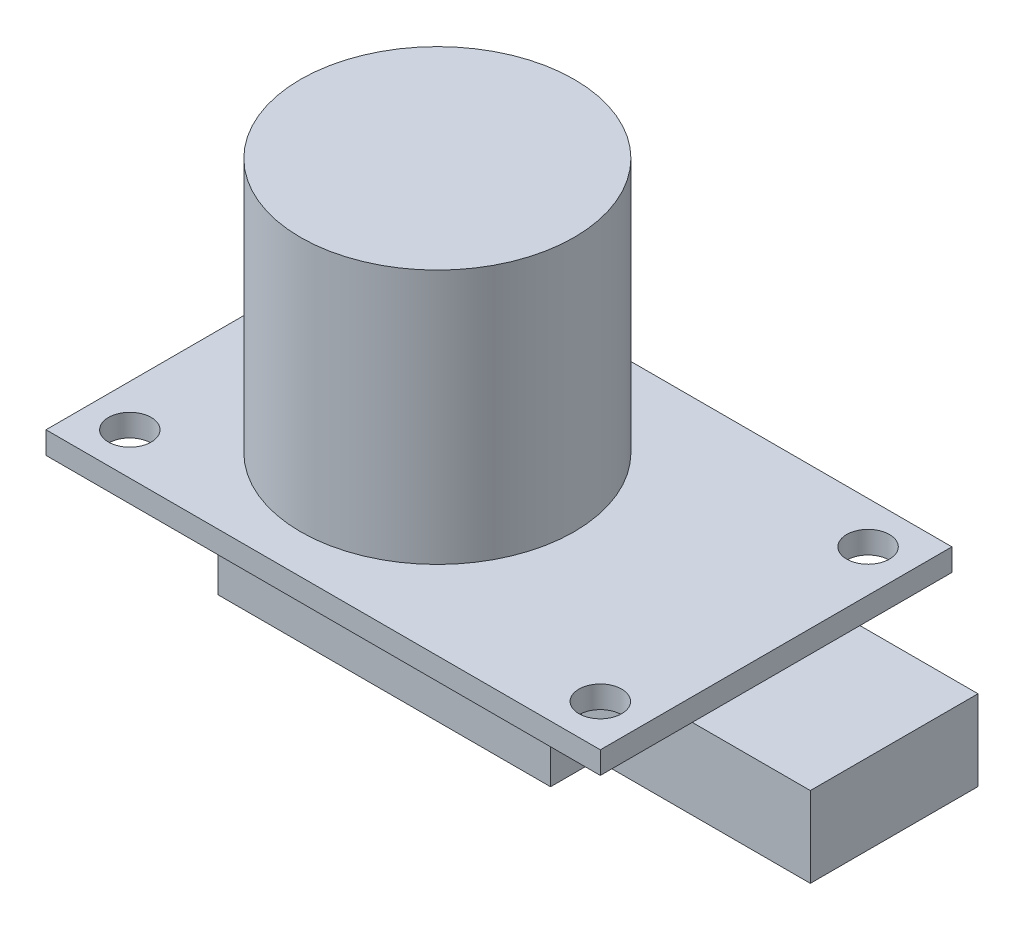
ISO-10303-21;
HEADER;
FILE_DESCRIPTION(('STEP AP214'),'2;1');
FILE_NAME('part.step','',(''),(''),'','','');
FILE_SCHEMA(('AUTOMOTIVE_DESIGN { 1 0 10303 214 1 1 1 1 }'));
ENDSEC;
DATA;
#1=APPLICATION_CONTEXT('core data for automotive mechanical design processes');
#2=APPLICATION_PROTOCOL_DEFINITION('international standard','automotive_design',2000,#1);
#3=PRODUCT_CONTEXT('',#1,'mechanical');
#4=PRODUCT('Part','Part','',(#3));
#5=PRODUCT_RELATED_PRODUCT_CATEGORY('part','',(#4));
#6=PRODUCT_DEFINITION_FORMATION('','',#4);
#7=PRODUCT_DEFINITION_CONTEXT('part definition',#1,'design');
#8=PRODUCT_DEFINITION('design','',#6,#7);
#9=PRODUCT_DEFINITION_SHAPE('','',#8);
#10=(LENGTH_UNIT() NAMED_UNIT(*) SI_UNIT(.MILLI.,.METRE.));
#11=(NAMED_UNIT(*) PLANE_ANGLE_UNIT() SI_UNIT($,.RADIAN.));
#12=(NAMED_UNIT(*) SI_UNIT($,.STERADIAN.) SOLID_ANGLE_UNIT());
#13=UNCERTAINTY_MEASURE_WITH_UNIT(LENGTH_MEASURE(1.E-05),#10,'distance_accuracy_value','');
#14=(GEOMETRIC_REPRESENTATION_CONTEXT(3) GLOBAL_UNCERTAINTY_ASSIGNED_CONTEXT((#13)) GLOBAL_UNIT_ASSIGNED_CONTEXT((#10,
#11,#12)) REPRESENTATION_CONTEXT('',''));
#15=CARTESIAN_POINT('',(0.,0.,0.));
#16=DIRECTION('',(0.,0.,1.));
#17=DIRECTION('',(1.,0.,0.));
#18=AXIS2_PLACEMENT_3D('',#15,#16,#17);
#19=CARTESIAN_POINT('',(0.,0.,0.));
#20=DIRECTION('',(0.,1.,0.));
#21=DIRECTION('',(0.,0.,1.));
#22=AXIS2_PLACEMENT_3D('',#19,#20,#21);
#23=PLANE('',#22);
#24=CARTESIAN_POINT('',(-13.75,0.,-7.825));
#25=DIRECTION('',(0.,1.,0.));
#26=DIRECTION('',(0.,0.,1.));
#27=AXIS2_PLACEMENT_3D('',#24,#25,#26);
#28=CIRCLE('',#27,1.25);
#29=CARTESIAN_POINT('',(-13.75,0.,-6.575));
#30=VERTEX_POINT('',#29);
#31=EDGE_CURVE('E212',#30,#30,#28,.T.);
#32=ORIENTED_EDGE('',*,*,#31,.T.);
#33=EDGE_LOOP('',(#32));
#34=FACE_BOUND('',#33,.T.);
#35=CARTESIAN_POINT('',(-13.75,0.,7.825));
#36=DIRECTION('',(0.,1.,0.));
#37=DIRECTION('',(0.,0.,-1.));
#38=AXIS2_PLACEMENT_3D('',#35,#36,#37);
#39=CIRCLE('',#38,1.25);
#40=CARTESIAN_POINT('',(-13.75,0.,6.575));
#41=VERTEX_POINT('',#40);
#42=EDGE_CURVE('E206',#41,#41,#39,.T.);
#43=ORIENTED_EDGE('',*,*,#42,.T.);
#44=EDGE_LOOP('',(#43));
#45=FACE_BOUND('',#44,.T.);
#46=CARTESIAN_POINT('',(13.75,0.,7.825));
#47=DIRECTION('',(0.,1.,0.));
#48=DIRECTION('',(0.,0.,1.));
#49=AXIS2_PLACEMENT_3D('',#46,#47,#48);
#50=CIRCLE('',#49,1.25);
#51=CARTESIAN_POINT('',(13.75,0.,9.075));
#52=VERTEX_POINT('',#51);
#53=EDGE_CURVE('E200',#52,#52,#50,.T.);
#54=ORIENTED_EDGE('',*,*,#53,.T.);
#55=EDGE_LOOP('',(#54));
#56=FACE_BOUND('',#55,.T.);
#57=CARTESIAN_POINT('',(13.75,0.,-7.825));
#58=DIRECTION('',(0.,1.,0.));
#59=DIRECTION('',(0.,0.,-1.));
#60=AXIS2_PLACEMENT_3D('',#57,#58,#59);
#61=CIRCLE('',#60,1.25);
#62=CARTESIAN_POINT('',(13.75,0.,-9.075));
#63=VERTEX_POINT('',#62);
#64=EDGE_CURVE('E194',#63,#63,#61,.T.);
#65=ORIENTED_EDGE('',*,*,#64,.T.);
#66=EDGE_LOOP('',(#65));
#67=FACE_BOUND('',#66,.T.);
#68=DIRECTION('',(-1.,0.,0.));
#69=VECTOR('',#68,1.);
#70=CARTESIAN_POINT('',(9.29999999999999,0.,4.9));
#71=LINE('',#70,#69);
#72=CARTESIAN_POINT('',(16.2,0.,4.9));
#73=VERTEX_POINT('',#72);
#74=CARTESIAN_POINT('',(9.71854455924344,0.,4.9));
#75=VERTEX_POINT('',#74);
#76=EDGE_CURVE('E279',#73,#75,#71,.T.);
#77=ORIENTED_EDGE('',*,*,#76,.F.);
#78=DIRECTION('',(0.,0.,-1.));
#79=VECTOR('',#78,1.);
#80=CARTESIAN_POINT('',(16.2,0.,-10.275));
#81=LINE('',#80,#79);
#82=CARTESIAN_POINT('',(16.2,0.,10.275));
#83=VERTEX_POINT('',#82);
#84=EDGE_CURVE('E232',#83,#73,#81,.T.);
#85=ORIENTED_EDGE('',*,*,#84,.F.);
#86=DIRECTION('',(1.,0.,0.));
#87=VECTOR('',#86,1.);
#88=CARTESIAN_POINT('',(-16.2,0.,10.275));
#89=LINE('',#88,#87);
#90=CARTESIAN_POINT('',(-16.2,0.,10.275));
#91=VERTEX_POINT('',#90);
#92=EDGE_CURVE('E225',#91,#83,#89,.T.);
#93=ORIENTED_EDGE('',*,*,#92,.F.);
#94=DIRECTION('',(0.,0.,1.));
#95=VECTOR('',#94,1.);
#96=CARTESIAN_POINT('',(-16.2,0.,-10.275));
#97=LINE('',#96,#95);
#98=CARTESIAN_POINT('',(-16.2,0.,-10.275));
#99=VERTEX_POINT('',#98);
#100=EDGE_CURVE('E237',#99,#91,#97,.T.);
#101=ORIENTED_EDGE('',*,*,#100,.F.);
#102=DIRECTION('',(-1.,0.,0.));
#103=VECTOR('',#102,1.);
#104=CARTESIAN_POINT('',(-16.2,0.,-10.275));
#105=LINE('',#104,#103);
#106=CARTESIAN_POINT('',(16.2,0.,-10.275));
#107=VERTEX_POINT('',#106);
#108=EDGE_CURVE('E235',#107,#99,#105,.T.);
#109=ORIENTED_EDGE('',*,*,#108,.F.);
#110=CARTESIAN_POINT('',(16.2,0.,-4.9));
#111=VERTEX_POINT('',#110);
#112=EDGE_CURVE('E218',#111,#107,#81,.T.);
#113=ORIENTED_EDGE('',*,*,#112,.F.);
#114=DIRECTION('',(1.,0.,0.));
#115=VECTOR('',#114,1.);
#116=CARTESIAN_POINT('',(9.29999999999999,0.,-4.9));
#117=LINE('',#116,#115);
#118=CARTESIAN_POINT('',(9.71854455924344,0.,-4.9));
#119=VERTEX_POINT('',#118);
#120=EDGE_CURVE('E147',#119,#111,#117,.T.);
#121=ORIENTED_EDGE('',*,*,#120,.F.);
#122=DIRECTION('',(0.,0.,1.));
#123=VECTOR('',#122,1.);
#124=CARTESIAN_POINT('',(9.71854455924344,0.,6.7024445236161));
#125=LINE('',#124,#123);
#126=CARTESIAN_POINT('',(9.71854455924344,0.,-6.7024445236161));
#127=VERTEX_POINT('',#126);
#128=EDGE_CURVE('E59',#127,#119,#125,.T.);
#129=ORIENTED_EDGE('',*,*,#128,.F.);
#130=DIRECTION('',(1.,0.,0.));
#131=VECTOR('',#130,1.);
#132=CARTESIAN_POINT('',(-9.71854455924344,0.,-6.7024445236161));
#133=LINE('',#132,#131);
#134=CARTESIAN_POINT('',(-9.71854455924344,0.,-6.7024445236161));
#135=VERTEX_POINT('',#134);
#136=EDGE_CURVE('E164',#135,#127,#133,.T.);
#137=ORIENTED_EDGE('',*,*,#136,.F.);
#138=DIRECTION('',(0.,0.,-1.));
#139=VECTOR('',#138,1.);
#140=CARTESIAN_POINT('',(-9.71854455924344,0.,6.7024445236161));
#141=LINE('',#140,#139);
#142=CARTESIAN_POINT('',(-9.71854455924344,0.,6.7024445236161));
#143=VERTEX_POINT('',#142);
#144=EDGE_CURVE('E175',#143,#135,#141,.T.);
#145=ORIENTED_EDGE('',*,*,#144,.F.);
#146=DIRECTION('',(-1.,0.,0.));
#147=VECTOR('',#146,1.);
#148=CARTESIAN_POINT('',(-9.71854455924344,0.,6.7024445236161));
#149=LINE('',#148,#147);
#150=CARTESIAN_POINT('',(9.71854455924344,0.,6.7024445236161));
#151=VERTEX_POINT('',#150);
#152=EDGE_CURVE('E172',#151,#143,#149,.T.);
#153=ORIENTED_EDGE('',*,*,#152,.F.);
#154=EDGE_CURVE('E155',#75,#151,#125,.T.);
#155=ORIENTED_EDGE('',*,*,#154,.F.);
#156=EDGE_LOOP('',(#77,#85,#93,#101,#109,#113,#121,#129,#137,#145,#153,#155));
#157=FACE_BOUND('',#156,.T.);
#158=ADVANCED_FACE('F37',(#34,#45,#56,#67,#157),#23,.F.);
#159=CARTESIAN_POINT('',(9.71854455924344,-5.6,6.7024445236161));
#160=DIRECTION('',(-1.,0.,0.));
#161=DIRECTION('',(0.,0.,1.));
#162=AXIS2_PLACEMENT_3D('',#159,#160,#161);
#163=PLANE('',#162);
#164=DIRECTION('',(0.,-1.,0.));
#165=VECTOR('',#164,1.);
#166=CARTESIAN_POINT('',(9.71854455924344,-5.6,4.9));
#167=LINE('',#166,#165);
#168=CARTESIAN_POINT('',(9.71854455924344,-4.7,4.9));
#169=VERTEX_POINT('',#168);
#170=EDGE_CURVE('E11',#75,#169,#167,.T.);
#171=ORIENTED_EDGE('',*,*,#170,.F.);
#172=ORIENTED_EDGE('',*,*,#154,.T.);
#173=DIRECTION('',(0.,1.,0.));
#174=VECTOR('',#173,1.);
#175=CARTESIAN_POINT('',(9.71854455924344,-5.6,6.7024445236161));
#176=LINE('',#175,#174);
#177=CARTESIAN_POINT('',(9.71854455924344,-5.6,6.7024445236161));
#178=VERTEX_POINT('',#177);
#179=EDGE_CURVE('E187',#178,#151,#176,.T.);
#180=ORIENTED_EDGE('',*,*,#179,.F.);
#181=DIRECTION('',(0.,0.,1.));
#182=VECTOR('',#181,1.);
#183=CARTESIAN_POINT('',(9.71854455924344,-5.6,6.7024445236161));
#184=LINE('',#183,#182);
#185=CARTESIAN_POINT('',(9.71854455924344,-5.6,-6.7024445236161));
#186=VERTEX_POINT('',#185);
#187=EDGE_CURVE('E160',#186,#178,#184,.T.);
#188=ORIENTED_EDGE('',*,*,#187,.F.);
#189=DIRECTION('',(0.,1.,0.));
#190=VECTOR('',#189,1.);
#191=CARTESIAN_POINT('',(9.71854455924344,-5.6,-6.7024445236161));
#192=LINE('',#191,#190);
#193=EDGE_CURVE('E170',#186,#127,#192,.T.);
#194=ORIENTED_EDGE('',*,*,#193,.T.);
#195=ORIENTED_EDGE('',*,*,#128,.T.);
#196=DIRECTION('',(0.,1.,0.));
#197=VECTOR('',#196,1.);
#198=CARTESIAN_POINT('',(9.71854455924344,-5.6,-4.9));
#199=LINE('',#198,#197);
#200=CARTESIAN_POINT('',(9.71854455924344,-4.7,-4.9));
#201=VERTEX_POINT('',#200);
#202=EDGE_CURVE('E45',#201,#119,#199,.T.);
#203=ORIENTED_EDGE('',*,*,#202,.F.);
#204=DIRECTION('',(0.,0.,1.));
#205=VECTOR('',#204,1.);
#206=CARTESIAN_POINT('',(9.71854455924344,-4.7,6.7024445236161));
#207=LINE('',#206,#205);
#208=EDGE_CURVE('E251',#201,#169,#207,.T.);
#209=ORIENTED_EDGE('',*,*,#208,.T.);
#210=EDGE_LOOP('',(#171,#172,#180,#188,#194,#195,#203,#209));
#211=FACE_BOUND('',#210,.T.);
#212=ADVANCED_FACE('F262',(#211),#163,.F.);
#213=CARTESIAN_POINT('',(0.,1.3,0.));
#214=DIRECTION('',(0.,1.,0.));
#215=DIRECTION('',(0.,0.,1.));
#216=AXIS2_PLACEMENT_3D('',#213,#214,#215);
#217=PLANE('',#216);
#218=CARTESIAN_POINT('',(-3.6,1.3,0.));
#219=DIRECTION('',(0.,1.,0.));
#220=DIRECTION('',(0.,0.,1.));
#221=AXIS2_PLACEMENT_3D('',#218,#219,#220);
#222=CIRCLE('',#221,8.);
#223=CARTESIAN_POINT('',(-3.6,1.3,8.));
#224=VERTEX_POINT('',#223);
#225=EDGE_CURVE('E190',#224,#224,#222,.T.);
#226=ORIENTED_EDGE('',*,*,#225,.F.);
#227=EDGE_LOOP('',(#226));
#228=FACE_BOUND('',#227,.T.);
#229=CARTESIAN_POINT('',(13.75,1.3,7.825));
#230=DIRECTION('',(0.,1.,0.));
#231=DIRECTION('',(0.,0.,1.));
#232=AXIS2_PLACEMENT_3D('',#229,#230,#231);
#233=CIRCLE('',#232,1.25);
#234=CARTESIAN_POINT('',(13.75,1.3,9.075));
#235=VERTEX_POINT('',#234);
#236=EDGE_CURVE('E203',#235,#235,#233,.T.);
#237=ORIENTED_EDGE('',*,*,#236,.F.);
#238=EDGE_LOOP('',(#237));
#239=FACE_BOUND('',#238,.T.);
#240=CARTESIAN_POINT('',(-13.75,1.3,-7.825));
#241=DIRECTION('',(0.,1.,0.));
#242=DIRECTION('',(0.,0.,1.));
#243=AXIS2_PLACEMENT_3D('',#240,#241,#242);
#244=CIRCLE('',#243,1.25);
#245=CARTESIAN_POINT('',(-13.75,1.3,-6.575));
#246=VERTEX_POINT('',#245);
#247=EDGE_CURVE('E215',#246,#246,#244,.T.);
#248=ORIENTED_EDGE('',*,*,#247,.F.);
#249=EDGE_LOOP('',(#248));
#250=FACE_BOUND('',#249,.T.);
#251=DIRECTION('',(0.,0.,-1.));
#252=VECTOR('',#251,1.);
#253=CARTESIAN_POINT('',(16.2,1.3,-10.275));
#254=LINE('',#253,#252);
#255=CARTESIAN_POINT('',(16.2,1.3,10.275));
#256=VERTEX_POINT('',#255);
#257=CARTESIAN_POINT('',(16.2,1.3,-10.275));
#258=VERTEX_POINT('',#257);
#259=EDGE_CURVE('E221',#256,#258,#254,.T.);
#260=ORIENTED_EDGE('',*,*,#259,.T.);
#261=DIRECTION('',(-1.,0.,0.));
#262=VECTOR('',#261,1.);
#263=CARTESIAN_POINT('',(-16.2,1.3,-10.275));
#264=LINE('',#263,#262);
#265=CARTESIAN_POINT('',(-16.2,1.3,-10.275));
#266=VERTEX_POINT('',#265);
#267=EDGE_CURVE('E224',#258,#266,#264,.T.);
#268=ORIENTED_EDGE('',*,*,#267,.T.);
#269=DIRECTION('',(0.,0.,1.));
#270=VECTOR('',#269,1.);
#271=CARTESIAN_POINT('',(-16.2,1.3,-10.275));
#272=LINE('',#271,#270);
#273=CARTESIAN_POINT('',(-16.2,1.3,10.275));
#274=VERTEX_POINT('',#273);
#275=EDGE_CURVE('E227',#266,#274,#272,.T.);
#276=ORIENTED_EDGE('',*,*,#275,.T.);
#277=DIRECTION('',(1.,0.,0.));
#278=VECTOR('',#277,1.);
#279=CARTESIAN_POINT('',(-16.2,1.3,10.275));
#280=LINE('',#279,#278);
#281=EDGE_CURVE('E229',#274,#256,#280,.T.);
#282=ORIENTED_EDGE('',*,*,#281,.T.);
#283=EDGE_LOOP('',(#260,#268,#276,#282));
#284=FACE_BOUND('',#283,.T.);
#285=CARTESIAN_POINT('',(-13.75,1.3,7.825));
#286=DIRECTION('',(0.,1.,0.));
#287=DIRECTION('',(0.,0.,-1.));
#288=AXIS2_PLACEMENT_3D('',#285,#286,#287);
#289=CIRCLE('',#288,1.25);
#290=CARTESIAN_POINT('',(-13.75,1.3,6.575));
#291=VERTEX_POINT('',#290);
#292=EDGE_CURVE('E209',#291,#291,#289,.T.);
#293=ORIENTED_EDGE('',*,*,#292,.F.);
#294=EDGE_LOOP('',(#293));
#295=FACE_BOUND('',#294,.T.);
#296=CARTESIAN_POINT('',(13.75,1.3,-7.825));
#297=DIRECTION('',(0.,1.,0.));
#298=DIRECTION('',(0.,0.,-1.));
#299=AXIS2_PLACEMENT_3D('',#296,#297,#298);
#300=CIRCLE('',#299,1.25);
#301=CARTESIAN_POINT('',(13.75,1.3,-9.075));
#302=VERTEX_POINT('',#301);
#303=EDGE_CURVE('E197',#302,#302,#300,.T.);
#304=ORIENTED_EDGE('',*,*,#303,.F.);
#305=EDGE_LOOP('',(#304));
#306=FACE_BOUND('',#305,.T.);
#307=ADVANCED_FACE('F299',(#228,#239,#250,#284,#295,#306),#217,.T.);
#308=CARTESIAN_POINT('',(16.2,1.3,-10.275));
#309=DIRECTION('',(-1.,0.,0.));
#310=DIRECTION('',(0.,0.,1.));
#311=AXIS2_PLACEMENT_3D('',#308,#309,#310);
#312=PLANE('',#311);
#313=ORIENTED_EDGE('',*,*,#84,.T.);
#314=DIRECTION('',(0.,0.,1.));
#315=VECTOR('',#314,1.);
#316=CARTESIAN_POINT('',(16.2,0.,-10.275));
#317=LINE('',#316,#315);
#318=EDGE_CURVE('E152',#111,#73,#317,.T.);
#319=ORIENTED_EDGE('',*,*,#318,.F.);
#320=ORIENTED_EDGE('',*,*,#112,.T.);
#321=DIRECTION('',(0.,-1.,0.));
#322=VECTOR('',#321,1.);
#323=CARTESIAN_POINT('',(16.2,1.3,-10.275));
#324=LINE('',#323,#322);
#325=EDGE_CURVE('E248',#258,#107,#324,.T.);
#326=ORIENTED_EDGE('',*,*,#325,.F.);
#327=ORIENTED_EDGE('',*,*,#259,.F.);
#328=DIRECTION('',(0.,-1.,0.));
#329=VECTOR('',#328,1.);
#330=CARTESIAN_POINT('',(16.2,1.3,10.275));
#331=LINE('',#330,#329);
#332=EDGE_CURVE('E231',#256,#83,#331,.T.);
#333=ORIENTED_EDGE('',*,*,#332,.T.);
#334=EDGE_LOOP('',(#313,#319,#320,#326,#327,#333));
#335=FACE_BOUND('',#334,.T.);
#336=ADVANCED_FACE('F39',(#335),#312,.F.);
#337=CARTESIAN_POINT('',(-16.2,1.3,-10.275));
#338=DIRECTION('',(0.,0.,1.));
#339=DIRECTION('',(1.,0.,0.));
#340=AXIS2_PLACEMENT_3D('',#337,#338,#339);
#341=PLANE('',#340);
#342=ORIENTED_EDGE('',*,*,#108,.T.);
#343=DIRECTION('',(0.,-1.,0.));
#344=VECTOR('',#343,1.);
#345=CARTESIAN_POINT('',(-16.2,1.3,-10.275));
#346=LINE('',#345,#344);
#347=EDGE_CURVE('E245',#266,#99,#346,.T.);
#348=ORIENTED_EDGE('',*,*,#347,.F.);
#349=ORIENTED_EDGE('',*,*,#267,.F.);
#350=ORIENTED_EDGE('',*,*,#325,.T.);
#351=EDGE_LOOP('',(#342,#348,#349,#350));
#352=FACE_BOUND('',#351,.T.);
#353=ADVANCED_FACE('F297',(#352),#341,.F.);
#354=CARTESIAN_POINT('',(-16.2,1.3,-10.275));
#355=DIRECTION('',(1.,0.,0.));
#356=DIRECTION('',(0.,0.,-1.));
#357=AXIS2_PLACEMENT_3D('',#354,#355,#356);
#358=PLANE('',#357);
#359=ORIENTED_EDGE('',*,*,#100,.T.);
#360=DIRECTION('',(0.,-1.,0.));
#361=VECTOR('',#360,1.);
#362=CARTESIAN_POINT('',(-16.2,1.3,10.275));
#363=LINE('',#362,#361);
#364=EDGE_CURVE('E242',#274,#91,#363,.T.);
#365=ORIENTED_EDGE('',*,*,#364,.F.);
#366=ORIENTED_EDGE('',*,*,#275,.F.);
#367=ORIENTED_EDGE('',*,*,#347,.T.);
#368=EDGE_LOOP('',(#359,#365,#366,#367));
#369=FACE_BOUND('',#368,.T.);
#370=ADVANCED_FACE('F293',(#369),#358,.F.);
#371=CARTESIAN_POINT('',(-16.2,1.3,10.275));
#372=DIRECTION('',(0.,0.,-1.));
#373=DIRECTION('',(-1.,0.,0.));
#374=AXIS2_PLACEMENT_3D('',#371,#372,#373);
#375=PLANE('',#374);
#376=ORIENTED_EDGE('',*,*,#92,.T.);
#377=ORIENTED_EDGE('',*,*,#332,.F.);
#378=ORIENTED_EDGE('',*,*,#281,.F.);
#379=ORIENTED_EDGE('',*,*,#364,.T.);
#380=EDGE_LOOP('',(#376,#377,#378,#379));
#381=FACE_BOUND('',#380,.T.);
#382=ADVANCED_FACE('F289',(#381),#375,.F.);
#383=CARTESIAN_POINT('',(-13.75,1.3,-7.825));
#384=DIRECTION('',(0.,-1.,0.));
#385=DIRECTION('',(0.,0.,-1.));
#386=AXIS2_PLACEMENT_3D('',#383,#384,#385);
#387=CYLINDRICAL_SURFACE('',#386,1.25);
#388=ORIENTED_EDGE('',*,*,#247,.T.);
#389=EDGE_LOOP('',(#388));
#390=FACE_BOUND('',#389,.T.);
#391=ORIENTED_EDGE('',*,*,#31,.F.);
#392=EDGE_LOOP('',(#391));
#393=FACE_BOUND('',#392,.T.);
#394=ADVANCED_FACE('F328',(#390,#393),#387,.F.);
#395=CARTESIAN_POINT('',(-13.75,1.3,7.825));
#396=DIRECTION('',(0.,-1.,0.));
#397=DIRECTION('',(0.,0.,-1.));
#398=AXIS2_PLACEMENT_3D('',#395,#396,#397);
#399=CYLINDRICAL_SURFACE('',#398,1.25);
#400=ORIENTED_EDGE('',*,*,#292,.T.);
#401=EDGE_LOOP('',(#400));
#402=FACE_BOUND('',#401,.T.);
#403=ORIENTED_EDGE('',*,*,#42,.F.);
#404=EDGE_LOOP('',(#403));
#405=FACE_BOUND('',#404,.T.);
#406=ADVANCED_FACE('F423',(#402,#405),#399,.F.);
#407=CARTESIAN_POINT('',(13.75,1.3,7.825));
#408=DIRECTION('',(0.,-1.,0.));
#409=DIRECTION('',(0.,0.,-1.));
#410=AXIS2_PLACEMENT_3D('',#407,#408,#409);
#411=CYLINDRICAL_SURFACE('',#410,1.25);
#412=ORIENTED_EDGE('',*,*,#236,.T.);
#413=EDGE_LOOP('',(#412));
#414=FACE_BOUND('',#413,.T.);
#415=ORIENTED_EDGE('',*,*,#53,.F.);
#416=EDGE_LOOP('',(#415));
#417=FACE_BOUND('',#416,.T.);
#418=ADVANCED_FACE('F312',(#414,#417),#411,.F.);
#419=CARTESIAN_POINT('',(13.75,1.3,-7.825));
#420=DIRECTION('',(0.,-1.,0.));
#421=DIRECTION('',(0.,0.,-1.));
#422=AXIS2_PLACEMENT_3D('',#419,#420,#421);
#423=CYLINDRICAL_SURFACE('',#422,1.25);
#424=ORIENTED_EDGE('',*,*,#303,.T.);
#425=EDGE_LOOP('',(#424));
#426=FACE_BOUND('',#425,.T.);
#427=ORIENTED_EDGE('',*,*,#64,.F.);
#428=EDGE_LOOP('',(#427));
#429=FACE_BOUND('',#428,.T.);
#430=ADVANCED_FACE('F308',(#426,#429),#423,.F.);
#431=CARTESIAN_POINT('',(-3.6,16.2,0.));
#432=DIRECTION('',(0.,-1.,0.));
#433=DIRECTION('',(0.,0.,-1.));
#434=AXIS2_PLACEMENT_3D('',#431,#432,#433);
#435=CYLINDRICAL_SURFACE('',#434,8.);
#436=CARTESIAN_POINT('',(-3.6,16.2,0.));
#437=DIRECTION('',(0.,1.,0.));
#438=DIRECTION('',(0.,0.,1.));
#439=AXIS2_PLACEMENT_3D('',#436,#437,#438);
#440=CIRCLE('',#439,8.);
#441=CARTESIAN_POINT('',(-3.6,16.2,8.));
#442=VERTEX_POINT('',#441);
#443=EDGE_CURVE('E191',#442,#442,#440,.T.);
#444=ORIENTED_EDGE('',*,*,#443,.F.);
#445=EDGE_LOOP('',(#444));
#446=FACE_BOUND('',#445,.T.);
#447=ORIENTED_EDGE('',*,*,#225,.T.);
#448=EDGE_LOOP('',(#447));
#449=FACE_BOUND('',#448,.T.);
#450=ADVANCED_FACE('F311',(#446,#449),#435,.T.);
#451=CARTESIAN_POINT('',(-3.6,16.2,0.));
#452=DIRECTION('',(0.,1.,0.));
#453=DIRECTION('',(0.,0.,1.));
#454=AXIS2_PLACEMENT_3D('',#451,#452,#453);
#455=PLANE('',#454);
#456=ORIENTED_EDGE('',*,*,#443,.T.);
#457=EDGE_LOOP('',(#456));
#458=FACE_BOUND('',#457,.T.);
#459=ADVANCED_FACE('F392',(#458),#455,.T.);
#460=CARTESIAN_POINT('',(-9.71854455924344,-5.6,6.7024445236161));
#461=DIRECTION('',(0.,0.,-1.));
#462=DIRECTION('',(-1.,0.,0.));
#463=AXIS2_PLACEMENT_3D('',#460,#461,#462);
#464=PLANE('',#463);
#465=ORIENTED_EDGE('',*,*,#152,.T.);
#466=DIRECTION('',(0.,1.,0.));
#467=VECTOR('',#466,1.);
#468=CARTESIAN_POINT('',(-9.71854455924344,-5.6,6.7024445236161));
#469=LINE('',#468,#467);
#470=CARTESIAN_POINT('',(-9.71854455924344,-5.6,6.7024445236161));
#471=VERTEX_POINT('',#470);
#472=EDGE_CURVE('E184',#471,#143,#469,.T.);
#473=ORIENTED_EDGE('',*,*,#472,.F.);
#474=DIRECTION('',(-1.,0.,0.));
#475=VECTOR('',#474,1.);
#476=CARTESIAN_POINT('',(-9.71854455924344,-5.6,6.7024445236161));
#477=LINE('',#476,#475);
#478=EDGE_CURVE('E163',#178,#471,#477,.T.);
#479=ORIENTED_EDGE('',*,*,#478,.F.);
#480=ORIENTED_EDGE('',*,*,#179,.T.);
#481=EDGE_LOOP('',(#465,#473,#479,#480));
#482=FACE_BOUND('',#481,.T.);
#483=ADVANCED_FACE('F276',(#482),#464,.F.);
#484=CARTESIAN_POINT('',(-9.71854455924344,-5.6,6.7024445236161));
#485=DIRECTION('',(1.,0.,0.));
#486=DIRECTION('',(0.,0.,-1.));
#487=AXIS2_PLACEMENT_3D('',#484,#485,#486);
#488=PLANE('',#487);
#489=ORIENTED_EDGE('',*,*,#144,.T.);
#490=DIRECTION('',(0.,1.,0.));
#491=VECTOR('',#490,1.);
#492=CARTESIAN_POINT('',(-9.71854455924344,-5.6,-6.7024445236161));
#493=LINE('',#492,#491);
#494=CARTESIAN_POINT('',(-9.71854455924344,-5.6,-6.7024445236161));
#495=VERTEX_POINT('',#494);
#496=EDGE_CURVE('E181',#495,#135,#493,.T.);
#497=ORIENTED_EDGE('',*,*,#496,.F.);
#498=DIRECTION('',(0.,0.,-1.));
#499=VECTOR('',#498,1.);
#500=CARTESIAN_POINT('',(-9.71854455924344,-5.6,6.7024445236161));
#501=LINE('',#500,#499);
#502=EDGE_CURVE('E166',#471,#495,#501,.T.);
#503=ORIENTED_EDGE('',*,*,#502,.F.);
#504=ORIENTED_EDGE('',*,*,#472,.T.);
#505=EDGE_LOOP('',(#489,#497,#503,#504));
#506=FACE_BOUND('',#505,.T.);
#507=ADVANCED_FACE('F272',(#506),#488,.F.);
#508=CARTESIAN_POINT('',(-9.71854455924344,-5.6,-6.7024445236161));
#509=DIRECTION('',(0.,0.,1.));
#510=DIRECTION('',(1.,0.,0.));
#511=AXIS2_PLACEMENT_3D('',#508,#509,#510);
#512=PLANE('',#511);
#513=ORIENTED_EDGE('',*,*,#136,.T.);
#514=ORIENTED_EDGE('',*,*,#193,.F.);
#515=DIRECTION('',(1.,0.,0.));
#516=VECTOR('',#515,1.);
#517=CARTESIAN_POINT('',(-9.71854455924344,-5.6,-6.7024445236161));
#518=LINE('',#517,#516);
#519=EDGE_CURVE('E168',#495,#186,#518,.T.);
#520=ORIENTED_EDGE('',*,*,#519,.F.);
#521=ORIENTED_EDGE('',*,*,#496,.T.);
#522=EDGE_LOOP('',(#513,#514,#520,#521));
#523=FACE_BOUND('',#522,.T.);
#524=ADVANCED_FACE('F268',(#523),#512,.F.);
#525=CARTESIAN_POINT('',(0.,-5.6,0.));
#526=DIRECTION('',(0.,-1.,0.));
#527=DIRECTION('',(0.,0.,-1.));
#528=AXIS2_PLACEMENT_3D('',#525,#526,#527);
#529=PLANE('',#528);
#530=ORIENTED_EDGE('',*,*,#187,.T.);
#531=ORIENTED_EDGE('',*,*,#478,.T.);
#532=ORIENTED_EDGE('',*,*,#502,.T.);
#533=ORIENTED_EDGE('',*,*,#519,.T.);
#534=EDGE_LOOP('',(#530,#531,#532,#533));
#535=FACE_BOUND('',#534,.T.);
#536=ADVANCED_FACE('F359',(#535),#529,.T.);
#537=CARTESIAN_POINT('',(9.29999999999999,-4.7,4.9));
#538=DIRECTION('',(0.,0.,-1.));
#539=DIRECTION('',(-1.,0.,0.));
#540=AXIS2_PLACEMENT_3D('',#537,#538,#539);
#541=PLANE('',#540);
#542=ORIENTED_EDGE('',*,*,#76,.T.);
#543=ORIENTED_EDGE('',*,*,#170,.T.);
#544=DIRECTION('',(-1.,0.,0.));
#545=VECTOR('',#544,1.);
#546=CARTESIAN_POINT('',(9.29999999999999,-4.7,4.9));
#547=LINE('',#546,#545);
#548=CARTESIAN_POINT('',(23.1,-4.7,4.9));
#549=VERTEX_POINT('',#548);
#550=EDGE_CURVE('E52',#549,#169,#547,.T.);
#551=ORIENTED_EDGE('',*,*,#550,.F.);
#552=DIRECTION('',(0.,1.,0.));
#553=VECTOR('',#552,1.);
#554=CARTESIAN_POINT('',(23.1,-4.7,4.9));
#555=LINE('',#554,#553);
#556=CARTESIAN_POINT('',(23.1,0.,4.9));
#557=VERTEX_POINT('',#556);
#558=EDGE_CURVE('E134',#549,#557,#555,.T.);
#559=ORIENTED_EDGE('',*,*,#558,.T.);
#560=EDGE_CURVE('E281',#557,#73,#71,.T.);
#561=ORIENTED_EDGE('',*,*,#560,.T.);
#562=EDGE_LOOP('',(#542,#543,#551,#559,#561));
#563=FACE_BOUND('',#562,.T.);
#564=ADVANCED_FACE('F131',(#563),#541,.F.);
#565=CARTESIAN_POINT('',(9.29999999999999,-4.7,-4.9));
#566=DIRECTION('',(0.,0.,1.));
#567=DIRECTION('',(1.,0.,0.));
#568=AXIS2_PLACEMENT_3D('',#565,#566,#567);
#569=PLANE('',#568);
#570=DIRECTION('',(1.,0.,0.));
#571=VECTOR('',#570,1.);
#572=CARTESIAN_POINT('',(9.29999999999999,-4.7,-4.9));
#573=LINE('',#572,#571);
#574=CARTESIAN_POINT('',(23.1,-4.7,-4.9));
#575=VERTEX_POINT('',#574);
#576=EDGE_CURVE('E138',#201,#575,#573,.T.);
#577=ORIENTED_EDGE('',*,*,#576,.F.);
#578=ORIENTED_EDGE('',*,*,#202,.T.);
#579=ORIENTED_EDGE('',*,*,#120,.T.);
#580=CARTESIAN_POINT('',(23.1,0.,-4.9));
#581=VERTEX_POINT('',#580);
#582=EDGE_CURVE('E261',#111,#581,#117,.T.);
#583=ORIENTED_EDGE('',*,*,#582,.T.);
#584=DIRECTION('',(0.,1.,0.));
#585=VECTOR('',#584,1.);
#586=CARTESIAN_POINT('',(23.1,-4.7,-4.9));
#587=LINE('',#586,#585);
#588=EDGE_CURVE('E153',#575,#581,#587,.T.);
#589=ORIENTED_EDGE('',*,*,#588,.F.);
#590=EDGE_LOOP('',(#577,#578,#579,#583,#589));
#591=FACE_BOUND('',#590,.T.);
#592=ADVANCED_FACE('F255',(#591),#569,.F.);
#593=CARTESIAN_POINT('',(0.,-4.7,0.));
#594=DIRECTION('',(0.,-1.,0.));
#595=DIRECTION('',(0.,0.,-1.));
#596=AXIS2_PLACEMENT_3D('',#593,#594,#595);
#597=PLANE('',#596);
#598=ORIENTED_EDGE('',*,*,#208,.F.);
#599=ORIENTED_EDGE('',*,*,#576,.T.);
#600=DIRECTION('',(0.,0.,1.));
#601=VECTOR('',#600,1.);
#602=CARTESIAN_POINT('',(23.1,-4.7,4.9));
#603=LINE('',#602,#601);
#604=EDGE_CURVE('E139',#575,#549,#603,.T.);
#605=ORIENTED_EDGE('',*,*,#604,.T.);
#606=ORIENTED_EDGE('',*,*,#550,.T.);
#607=EDGE_LOOP('',(#598,#599,#605,#606));
#608=FACE_BOUND('',#607,.T.);
#609=ADVANCED_FACE('F142',(#608),#597,.T.);
#610=CARTESIAN_POINT('',(0.,0.,0.));
#611=DIRECTION('',(0.,-1.,0.));
#612=DIRECTION('',(0.,0.,-1.));
#613=AXIS2_PLACEMENT_3D('',#610,#611,#612);
#614=PLANE('',#613);
#615=ORIENTED_EDGE('',*,*,#582,.F.);
#616=ORIENTED_EDGE('',*,*,#318,.T.);
#617=ORIENTED_EDGE('',*,*,#560,.F.);
#618=DIRECTION('',(0.,0.,1.));
#619=VECTOR('',#618,1.);
#620=CARTESIAN_POINT('',(23.1,0.,4.9));
#621=LINE('',#620,#619);
#622=EDGE_CURVE('E151',#581,#557,#621,.T.);
#623=ORIENTED_EDGE('',*,*,#622,.F.);
#624=EDGE_LOOP('',(#615,#616,#617,#623));
#625=FACE_BOUND('',#624,.T.);
#626=ADVANCED_FACE('F496',(#625),#614,.F.);
#627=CARTESIAN_POINT('',(23.1,-4.7,4.9));
#628=DIRECTION('',(-1.,0.,0.));
#629=DIRECTION('',(0.,0.,1.));
#630=AXIS2_PLACEMENT_3D('',#627,#628,#629);
#631=PLANE('',#630);
#632=ORIENTED_EDGE('',*,*,#622,.T.);
#633=ORIENTED_EDGE('',*,*,#558,.F.);
#634=ORIENTED_EDGE('',*,*,#604,.F.);
#635=ORIENTED_EDGE('',*,*,#588,.T.);
#636=EDGE_LOOP('',(#632,#633,#634,#635));
#637=FACE_BOUND('',#636,.T.);
#638=ADVANCED_FACE('F149',(#637),#631,.F.);
#639=CLOSED_SHELL('',(#158,#212,#307,#336,#353,#370,#382,#394,#406,#418,#430,#450,#459,#483,
#507,#524,#536,#564,#592,#609,#626,#638));
#640=MANIFOLD_SOLID_BREP('B2',#639);
#641=ADVANCED_BREP_SHAPE_REPRESENTATION('',(#18,#640),#14);
#642=SHAPE_DEFINITION_REPRESENTATION(#9,#641);
ENDSEC;
END-ISO-10303-21;
